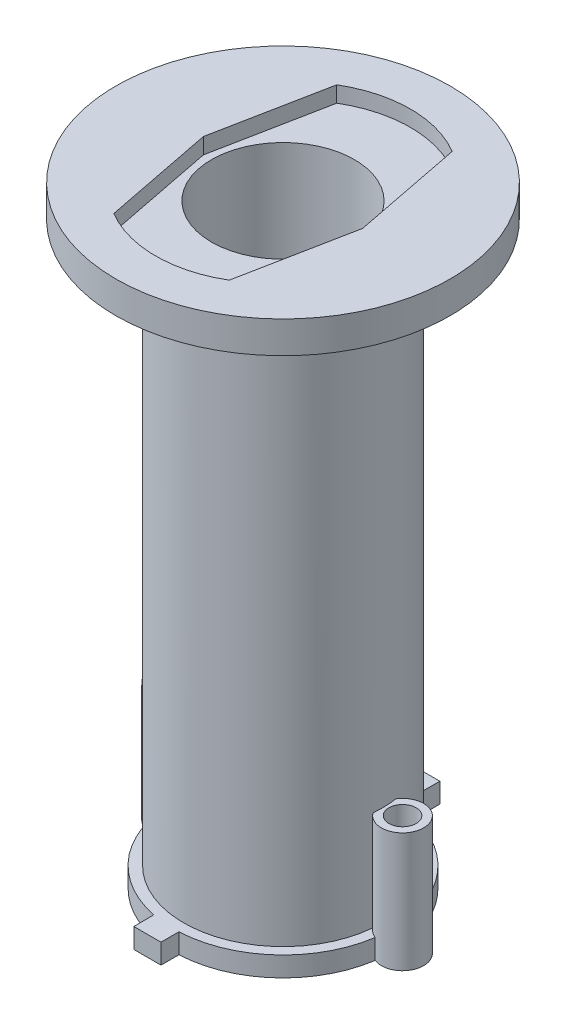
ISO-10303-21;
HEADER;
FILE_DESCRIPTION(('STEP AP214'),'2;1');
FILE_NAME('part.step','',(''),(''),'','','');
FILE_SCHEMA(('AUTOMOTIVE_DESIGN { 1 0 10303 214 1 1 1 1 }'));
ENDSEC;
DATA;
#1=APPLICATION_CONTEXT('core data for automotive mechanical design processes');
#2=APPLICATION_PROTOCOL_DEFINITION('international standard','automotive_design',2000,#1);
#3=PRODUCT_CONTEXT('',#1,'mechanical');
#4=PRODUCT('Part','Part','',(#3));
#5=PRODUCT_RELATED_PRODUCT_CATEGORY('part','',(#4));
#6=PRODUCT_DEFINITION_FORMATION('','',#4);
#7=PRODUCT_DEFINITION_CONTEXT('part definition',#1,'design');
#8=PRODUCT_DEFINITION('design','',#6,#7);
#9=PRODUCT_DEFINITION_SHAPE('','',#8);
#10=(LENGTH_UNIT() NAMED_UNIT(*) SI_UNIT(.MILLI.,.METRE.));
#11=(NAMED_UNIT(*) PLANE_ANGLE_UNIT() SI_UNIT($,.RADIAN.));
#12=(NAMED_UNIT(*) SI_UNIT($,.STERADIAN.) SOLID_ANGLE_UNIT());
#13=UNCERTAINTY_MEASURE_WITH_UNIT(LENGTH_MEASURE(1.E-05),#10,'distance_accuracy_value','');
#14=(GEOMETRIC_REPRESENTATION_CONTEXT(3) GLOBAL_UNCERTAINTY_ASSIGNED_CONTEXT((#13)) GLOBAL_UNIT_ASSIGNED_CONTEXT((#10,
#11,#12)) REPRESENTATION_CONTEXT('',''));
#15=CARTESIAN_POINT('',(0.,0.,0.));
#16=DIRECTION('',(0.,0.,1.));
#17=DIRECTION('',(1.,0.,0.));
#18=AXIS2_PLACEMENT_3D('',#15,#16,#17);
#19=CARTESIAN_POINT('',(-0.0762000000000037,2.5,1.51384));
#20=DIRECTION('',(0.,1.,0.));
#21=DIRECTION('',(0.,0.,1.));
#22=AXIS2_PLACEMENT_3D('',#19,#20,#21);
#23=PLANE('',#22);
#24=CARTESIAN_POINT('',(-14.5034,2.5,1.0795));
#25=DIRECTION('',(0.,1.,0.));
#26=DIRECTION('',(0.,0.,1.));
#27=AXIS2_PLACEMENT_3D('',#24,#25,#26);
#28=CIRCLE('',#27,2.6543);
#29=CARTESIAN_POINT('',(-12.3886077372189,2.5,-0.524545565213582));
#30=VERTEX_POINT('',#29);
#31=CARTESIAN_POINT('',(-13.5330312519173,2.5,-1.39106531642952));
#32=VERTEX_POINT('',#31);
#33=EDGE_CURVE('E253',#30,#32,#28,.T.);
#34=ORIENTED_EDGE('',*,*,#33,.F.);
#35=CARTESIAN_POINT('',(-0.0762000000000037,2.5,1.51384));
#36=DIRECTION('',(0.,1.,0.));
#37=DIRECTION('',(0.,0.,1.));
#38=AXIS2_PLACEMENT_3D('',#35,#36,#37);
#39=CIRCLE('',#38,12.48);
#40=CARTESIAN_POINT('',(12.2644264634765,2.5,-0.346089700000451));
#41=VERTEX_POINT('',#40);
#42=EDGE_CURVE('E332',#41,#30,#39,.T.);
#43=ORIENTED_EDGE('',*,*,#42,.F.);
#44=CARTESIAN_POINT('',(14.5034,2.5,1.0795));
#45=DIRECTION('',(0.,1.,0.));
#46=DIRECTION('',(0.,0.,1.));
#47=AXIS2_PLACEMENT_3D('',#44,#45,#46);
#48=CIRCLE('',#47,2.65430000000001);
#49=CARTESIAN_POINT('',(13.3933444870035,2.5,-1.33153406198795));
#50=VERTEX_POINT('',#49);
#51=EDGE_CURVE('E254',#50,#41,#48,.T.);
#52=ORIENTED_EDGE('',*,*,#51,.F.);
#53=CARTESIAN_POINT('',(-0.0762000000000037,2.5,1.51384));
#54=DIRECTION('',(0.,1.,0.));
#55=DIRECTION('',(0.,0.,1.));
#56=AXIS2_PLACEMENT_3D('',#53,#54,#55);
#57=CIRCLE('',#56,13.7668);
#58=CARTESIAN_POINT('',(0.597960957999996,2.5,-12.2364432422721));
#59=VERTEX_POINT('',#58);
#60=EDGE_CURVE('E188',#50,#59,#57,.T.);
#61=ORIENTED_EDGE('',*,*,#60,.T.);
#62=DIRECTION('',(0.,0.,-1.));
#63=VECTOR('',#62,1.);
#64=CARTESIAN_POINT('',(0.597960957999996,2.5,-12.2364432422721));
#65=LINE('',#64,#63);
#66=CARTESIAN_POINT('',(0.597960957999998,2.5,-17.5133));
#67=VERTEX_POINT('',#66);
#68=EDGE_CURVE('E110',#59,#67,#65,.T.);
#69=ORIENTED_EDGE('',*,*,#68,.T.);
#70=DIRECTION('',(-1.,0.,0.));
#71=VECTOR('',#70,1.);
#72=CARTESIAN_POINT('',(0.597960957999998,2.5,-17.5133));
#73=LINE('',#72,#71);
#74=CARTESIAN_POINT('',(-2.819411684,2.5,-17.5133));
#75=VERTEX_POINT('',#74);
#76=EDGE_CURVE('E214',#67,#75,#73,.T.);
#77=ORIENTED_EDGE('',*,*,#76,.T.);
#78=DIRECTION('',(0.,0.,1.));
#79=VECTOR('',#78,1.);
#80=CARTESIAN_POINT('',(-2.819411684,2.5,-17.5133));
#81=LINE('',#80,#79);
#82=CARTESIAN_POINT('',(-2.819411684,2.5,-11.9768816966612));
#83=VERTEX_POINT('',#82);
#84=EDGE_CURVE('E234',#75,#83,#81,.T.);
#85=ORIENTED_EDGE('',*,*,#84,.T.);
#86=CARTESIAN_POINT('',(-0.0762000000000037,2.5,1.51384));
#87=DIRECTION('',(0.,1.,0.));
#88=DIRECTION('',(0.,0.,1.));
#89=AXIS2_PLACEMENT_3D('',#86,#87,#88);
#90=CIRCLE('',#89,13.7668);
#91=EDGE_CURVE('E230',#83,#32,#90,.T.);
#92=ORIENTED_EDGE('',*,*,#91,.T.);
#93=EDGE_LOOP('',(#34,#43,#52,#61,#69,#77,#85,#92));
#94=FACE_BOUND('',#93,.T.);
#95=ADVANCED_FACE('F33',(#94),#23,.T.);
#96=CARTESIAN_POINT('',(12.3532611180342,2.5,2.63584548807739));
#97=VERTEX_POINT('',#96);
#98=CARTESIAN_POINT('',(13.5388396547462,2.5,3.55233882013443));
#99=VERTEX_POINT('',#98);
#100=EDGE_CURVE('E57',#97,#99,#48,.T.);
#101=ORIENTED_EDGE('',*,*,#100,.F.);
#102=CARTESIAN_POINT('',(-12.4889319057638,2.5,2.80785956539843));
#103=VERTEX_POINT('',#102);
#104=EDGE_CURVE('E329',#103,#97,#39,.T.);
#105=ORIENTED_EDGE('',*,*,#104,.F.);
#106=CARTESIAN_POINT('',(-13.6834098116879,2.5,3.60396520694422));
#107=VERTEX_POINT('',#106);
#108=EDGE_CURVE('E248',#107,#103,#28,.T.);
#109=ORIENTED_EDGE('',*,*,#108,.F.);
#110=CARTESIAN_POINT('',(-0.0762000000000037,2.5,1.51384));
#111=DIRECTION('',(0.,1.,0.));
#112=DIRECTION('',(0.,0.,1.));
#113=AXIS2_PLACEMENT_3D('',#110,#111,#112);
#114=CIRCLE('',#113,13.7668);
#115=CARTESIAN_POINT('',(-2.81941168400001,2.5,15.0045616966612));
#116=VERTEX_POINT('',#115);
#117=EDGE_CURVE('E233',#107,#116,#114,.T.);
#118=ORIENTED_EDGE('',*,*,#117,.T.);
#119=DIRECTION('',(0.,0.,1.));
#120=VECTOR('',#119,1.);
#121=CARTESIAN_POINT('',(-2.81941168400001,2.5,15.0045616966612));
#122=LINE('',#121,#120);
#123=CARTESIAN_POINT('',(-2.819411684,2.5,17.5133));
#124=VERTEX_POINT('',#123);
#125=EDGE_CURVE('E140',#116,#124,#122,.T.);
#126=ORIENTED_EDGE('',*,*,#125,.T.);
#127=DIRECTION('',(1.,0.,0.));
#128=VECTOR('',#127,1.);
#129=CARTESIAN_POINT('',(-2.819411684,2.5,17.5133));
#130=LINE('',#129,#128);
#131=CARTESIAN_POINT('',(0.597960957999998,2.5,17.5133));
#132=VERTEX_POINT('',#131);
#133=EDGE_CURVE('E133',#124,#132,#130,.T.);
#134=ORIENTED_EDGE('',*,*,#133,.T.);
#135=DIRECTION('',(0.,0.,-1.));
#136=VECTOR('',#135,1.);
#137=CARTESIAN_POINT('',(0.597960957999998,2.5,17.5133));
#138=LINE('',#137,#136);
#139=CARTESIAN_POINT('',(0.597960957999998,2.5,15.2641232422721));
#140=VERTEX_POINT('',#139);
#141=EDGE_CURVE('E137',#132,#140,#138,.T.);
#142=ORIENTED_EDGE('',*,*,#141,.T.);
#143=CARTESIAN_POINT('',(-0.0762000000000037,2.5,1.51384));
#144=DIRECTION('',(0.,1.,0.));
#145=DIRECTION('',(0.,0.,1.));
#146=AXIS2_PLACEMENT_3D('',#143,#144,#145);
#147=CIRCLE('',#146,13.7668);
#148=EDGE_CURVE('E158',#140,#99,#147,.T.);
#149=ORIENTED_EDGE('',*,*,#148,.T.);
#150=EDGE_LOOP('',(#101,#105,#109,#118,#126,#134,#142,#149));
#151=FACE_BOUND('',#150,.T.);
#152=ADVANCED_FACE('F135',(#151),#23,.T.);
#153=CARTESIAN_POINT('',(-14.5034,2.5,1.0795));
#154=DIRECTION('',(0.,-1.,0.));
#155=DIRECTION('',(0.,0.,-1.));
#156=AXIS2_PLACEMENT_3D('',#153,#154,#155);
#157=CYLINDRICAL_SURFACE('',#156,2.6543);
#158=DIRECTION('',(0.,-1.,0.));
#159=VECTOR('',#158,1.);
#160=CARTESIAN_POINT('',(-12.4889319057638,19.1525,2.80785956539843));
#161=LINE('',#160,#159);
#162=CARTESIAN_POINT('',(-12.4889319057638,15.,2.80785956539843));
#163=VERTEX_POINT('',#162);
#164=EDGE_CURVE('E316',#163,#103,#161,.T.);
#165=ORIENTED_EDGE('',*,*,#164,.F.);
#166=CARTESIAN_POINT('',(-14.5034,15.,1.0795));
#167=DIRECTION('',(0.,-1.,0.));
#168=DIRECTION('',(0.,0.,-1.));
#169=AXIS2_PLACEMENT_3D('',#166,#167,#168);
#170=CIRCLE('',#169,2.6543);
#171=CARTESIAN_POINT('',(-12.3886077372189,15.,-0.524545565213582));
#172=VERTEX_POINT('',#171);
#173=EDGE_CURVE('E333',#163,#172,#170,.T.);
#174=ORIENTED_EDGE('',*,*,#173,.T.);
#175=DIRECTION('',(0.,-1.,0.));
#176=VECTOR('',#175,1.);
#177=CARTESIAN_POINT('',(-12.3886077372189,19.1525,-0.524545565213585));
#178=LINE('',#177,#176);
#179=EDGE_CURVE('E322',#30,#172,#178,.F.);
#180=ORIENTED_EDGE('',*,*,#179,.F.);
#181=ORIENTED_EDGE('',*,*,#33,.T.);
#182=DIRECTION('',(0.,-1.,0.));
#183=VECTOR('',#182,1.);
#184=CARTESIAN_POINT('',(-13.5330312519173,2.5,-1.39106531642952));
#185=LINE('',#184,#183);
#186=CARTESIAN_POINT('',(-13.5330312519173,0.,-1.39106531642952));
#187=VERTEX_POINT('',#186);
#188=EDGE_CURVE('E200',#32,#187,#185,.T.);
#189=ORIENTED_EDGE('',*,*,#188,.T.);
#190=CARTESIAN_POINT('',(-14.5034,0.,1.0795));
#191=DIRECTION('',(0.,1.,0.));
#192=DIRECTION('',(0.,0.,1.));
#193=AXIS2_PLACEMENT_3D('',#190,#191,#192);
#194=CIRCLE('',#193,2.6543);
#195=CARTESIAN_POINT('',(-13.6834098116879,0.,3.60396520694422));
#196=VERTEX_POINT('',#195);
#197=EDGE_CURVE('E176',#187,#196,#194,.T.);
#198=ORIENTED_EDGE('',*,*,#197,.T.);
#199=DIRECTION('',(0.,-1.,0.));
#200=VECTOR('',#199,1.);
#201=CARTESIAN_POINT('',(-13.6834098116879,2.5,3.60396520694422));
#202=LINE('',#201,#200);
#203=EDGE_CURVE('E197',#107,#196,#202,.T.);
#204=ORIENTED_EDGE('',*,*,#203,.F.);
#205=ORIENTED_EDGE('',*,*,#108,.T.);
#206=EDGE_LOOP('',(#165,#174,#180,#181,#189,#198,#204,#205));
#207=FACE_BOUND('',#206,.T.);
#208=ADVANCED_FACE('F367',(#207),#157,.T.);
#209=CARTESIAN_POINT('',(14.5034,2.5,1.0795));
#210=DIRECTION('',(0.,-1.,0.));
#211=DIRECTION('',(0.,0.,-1.));
#212=AXIS2_PLACEMENT_3D('',#209,#210,#211);
#213=CYLINDRICAL_SURFACE('',#212,2.6543);
#214=DIRECTION('',(0.,-1.,0.));
#215=VECTOR('',#214,1.);
#216=CARTESIAN_POINT('',(12.2644264634765,19.1525,-0.346089700000466));
#217=LINE('',#216,#215);
#218=CARTESIAN_POINT('',(12.2644264634765,15.,-0.346089700000459));
#219=VERTEX_POINT('',#218);
#220=EDGE_CURVE('E325',#219,#41,#217,.T.);
#221=ORIENTED_EDGE('',*,*,#220,.F.);
#222=CARTESIAN_POINT('',(14.5034,15.,1.0795));
#223=DIRECTION('',(0.,-1.,0.));
#224=DIRECTION('',(0.,0.,-1.));
#225=AXIS2_PLACEMENT_3D('',#222,#223,#224);
#226=CIRCLE('',#225,2.6543);
#227=CARTESIAN_POINT('',(12.3532611180342,15.,2.6358454880774));
#228=VERTEX_POINT('',#227);
#229=EDGE_CURVE('E338',#219,#228,#226,.T.);
#230=ORIENTED_EDGE('',*,*,#229,.T.);
#231=DIRECTION('',(0.,-1.,0.));
#232=VECTOR('',#231,1.);
#233=CARTESIAN_POINT('',(12.3532611180342,19.1525,2.63584548807741));
#234=LINE('',#233,#232);
#235=EDGE_CURVE('E319',#97,#228,#234,.F.);
#236=ORIENTED_EDGE('',*,*,#235,.F.);
#237=ORIENTED_EDGE('',*,*,#100,.T.);
#238=DIRECTION('',(0.,-1.,0.));
#239=VECTOR('',#238,1.);
#240=CARTESIAN_POINT('',(13.5388396547462,2.5,3.55233882013443));
#241=LINE('',#240,#239);
#242=CARTESIAN_POINT('',(13.5388396547462,0.,3.55233882013443));
#243=VERTEX_POINT('',#242);
#244=EDGE_CURVE('E190',#99,#243,#241,.T.);
#245=ORIENTED_EDGE('',*,*,#244,.T.);
#246=CARTESIAN_POINT('',(14.5034,0.,1.0795));
#247=DIRECTION('',(0.,1.,0.));
#248=DIRECTION('',(0.,0.,1.));
#249=AXIS2_PLACEMENT_3D('',#246,#247,#248);
#250=CIRCLE('',#249,2.6543);
#251=CARTESIAN_POINT('',(13.3933444870035,0.,-1.33153406198795));
#252=VERTEX_POINT('',#251);
#253=EDGE_CURVE('E102',#243,#252,#250,.T.);
#254=ORIENTED_EDGE('',*,*,#253,.T.);
#255=DIRECTION('',(0.,-1.,0.));
#256=VECTOR('',#255,1.);
#257=CARTESIAN_POINT('',(13.3933444870035,2.5,-1.33153406198795));
#258=LINE('',#257,#256);
#259=EDGE_CURVE('E160',#50,#252,#258,.T.);
#260=ORIENTED_EDGE('',*,*,#259,.F.);
#261=ORIENTED_EDGE('',*,*,#51,.T.);
#262=EDGE_LOOP('',(#221,#230,#236,#237,#245,#254,#260,#261));
#263=FACE_BOUND('',#262,.T.);
#264=ADVANCED_FACE('F380',(#263),#213,.T.);
#265=CARTESIAN_POINT('',(-0.0762000000000037,72.805,1.51384));
#266=DIRECTION('',(0.,1.,0.));
#267=DIRECTION('',(0.,0.,1.));
#268=AXIS2_PLACEMENT_3D('',#265,#266,#267);
#269=PLANE('',#268);
#270=CARTESIAN_POINT('',(-0.0762000000000037,72.805,1.51384));
#271=DIRECTION('',(0.,1.,0.));
#272=DIRECTION('',(0.,0.,1.));
#273=AXIS2_PLACEMENT_3D('',#270,#271,#272);
#274=CIRCLE('',#273,21.);
#275=CARTESIAN_POINT('',(-0.0762000000000037,72.805,22.51384));
#276=VERTEX_POINT('',#275);
#277=EDGE_CURVE('E257',#276,#276,#274,.T.);
#278=ORIENTED_EDGE('',*,*,#277,.F.);
#279=EDGE_LOOP('',(#278));
#280=FACE_BOUND('',#279,.T.);
#281=CARTESIAN_POINT('',(-0.0762000000000037,72.805,1.51384));
#282=DIRECTION('',(0.,1.,0.));
#283=DIRECTION('',(0.,0.,1.));
#284=AXIS2_PLACEMENT_3D('',#281,#282,#283);
#285=CIRCLE('',#284,12.48);
#286=CARTESIAN_POINT('',(-0.0762000000000037,72.805,13.99384));
#287=VERTEX_POINT('',#286);
#288=EDGE_CURVE('E328',#287,#287,#285,.T.);
#289=ORIENTED_EDGE('',*,*,#288,.T.);
#290=EDGE_LOOP('',(#289));
#291=FACE_BOUND('',#290,.T.);
#292=ADVANCED_FACE('F470',(#280,#291),#269,.F.);
#293=CARTESIAN_POINT('',(-0.0762000000000037,2.5,1.51384));
#294=DIRECTION('',(0.,-1.,0.));
#295=DIRECTION('',(0.,0.,-1.));
#296=AXIS2_PLACEMENT_3D('',#293,#294,#295);
#297=CYLINDRICAL_SURFACE('',#296,13.7668);
#298=CARTESIAN_POINT('',(-0.0762000000000037,0.,1.51384));
#299=DIRECTION('',(0.,1.,0.));
#300=DIRECTION('',(0.,0.,1.));
#301=AXIS2_PLACEMENT_3D('',#298,#299,#300);
#302=CIRCLE('',#301,13.7668);
#303=CARTESIAN_POINT('',(0.597960957999996,0.,-12.2364432422721));
#304=VERTEX_POINT('',#303);
#305=EDGE_CURVE('E164',#252,#304,#302,.T.);
#306=ORIENTED_EDGE('',*,*,#305,.T.);
#307=DIRECTION('',(0.,-1.,0.));
#308=VECTOR('',#307,1.);
#309=CARTESIAN_POINT('',(0.597960957999996,2.5,-12.2364432422721));
#310=LINE('',#309,#308);
#311=EDGE_CURVE('E11',#59,#304,#310,.T.);
#312=ORIENTED_EDGE('',*,*,#311,.F.);
#313=ORIENTED_EDGE('',*,*,#60,.F.);
#314=ORIENTED_EDGE('',*,*,#259,.T.);
#315=EDGE_LOOP('',(#306,#312,#313,#314));
#316=FACE_BOUND('',#315,.T.);
#317=ADVANCED_FACE('F35',(#316),#297,.T.);
#318=CARTESIAN_POINT('',(0.597960957999996,2.5,-12.2364432422721));
#319=DIRECTION('',(-1.,0.,0.));
#320=DIRECTION('',(0.,0.,1.));
#321=AXIS2_PLACEMENT_3D('',#318,#319,#320);
#322=PLANE('',#321);
#323=DIRECTION('',(0.,0.,-1.));
#324=VECTOR('',#323,1.);
#325=CARTESIAN_POINT('',(0.597960957999996,0.,-12.2364432422721));
#326=LINE('',#325,#324);
#327=CARTESIAN_POINT('',(0.597960957999998,0.,-17.5133));
#328=VERTEX_POINT('',#327);
#329=EDGE_CURVE('E167',#304,#328,#326,.T.);
#330=ORIENTED_EDGE('',*,*,#329,.T.);
#331=DIRECTION('',(0.,-1.,0.));
#332=VECTOR('',#331,1.);
#333=CARTESIAN_POINT('',(0.597960957999998,2.5,-17.5133));
#334=LINE('',#333,#332);
#335=EDGE_CURVE('E41',#67,#328,#334,.T.);
#336=ORIENTED_EDGE('',*,*,#335,.F.);
#337=ORIENTED_EDGE('',*,*,#68,.F.);
#338=ORIENTED_EDGE('',*,*,#311,.T.);
#339=EDGE_LOOP('',(#330,#336,#337,#338));
#340=FACE_BOUND('',#339,.T.);
#341=ADVANCED_FACE('F492',(#340),#322,.F.);
#342=CARTESIAN_POINT('',(0.597960957999998,2.5,-17.5133));
#343=DIRECTION('',(0.,0.,1.));
#344=DIRECTION('',(1.,0.,0.));
#345=AXIS2_PLACEMENT_3D('',#342,#343,#344);
#346=PLANE('',#345);
#347=DIRECTION('',(-1.,0.,0.));
#348=VECTOR('',#347,1.);
#349=CARTESIAN_POINT('',(0.597960957999998,0.,-17.5133));
#350=LINE('',#349,#348);
#351=CARTESIAN_POINT('',(-2.819411684,0.,-17.5133));
#352=VERTEX_POINT('',#351);
#353=EDGE_CURVE('E170',#328,#352,#350,.T.);
#354=ORIENTED_EDGE('',*,*,#353,.T.);
#355=DIRECTION('',(0.,-1.,0.));
#356=VECTOR('',#355,1.);
#357=CARTESIAN_POINT('',(-2.819411684,2.5,-17.5133));
#358=LINE('',#357,#356);
#359=EDGE_CURVE('E206',#75,#352,#358,.T.);
#360=ORIENTED_EDGE('',*,*,#359,.F.);
#361=ORIENTED_EDGE('',*,*,#76,.F.);
#362=ORIENTED_EDGE('',*,*,#335,.T.);
#363=EDGE_LOOP('',(#354,#360,#361,#362));
#364=FACE_BOUND('',#363,.T.);
#365=ADVANCED_FACE('F212',(#364),#346,.F.);
#366=CARTESIAN_POINT('',(-2.819411684,2.5,-17.5133));
#367=DIRECTION('',(1.,0.,0.));
#368=DIRECTION('',(0.,0.,-1.));
#369=AXIS2_PLACEMENT_3D('',#366,#367,#368);
#370=PLANE('',#369);
#371=DIRECTION('',(0.,0.,1.));
#372=VECTOR('',#371,1.);
#373=CARTESIAN_POINT('',(-2.819411684,0.,-17.5133));
#374=LINE('',#373,#372);
#375=CARTESIAN_POINT('',(-2.819411684,0.,-11.9768816966612));
#376=VERTEX_POINT('',#375);
#377=EDGE_CURVE('E172',#352,#376,#374,.T.);
#378=ORIENTED_EDGE('',*,*,#377,.T.);
#379=DIRECTION('',(0.,-1.,0.));
#380=VECTOR('',#379,1.);
#381=CARTESIAN_POINT('',(-2.819411684,2.5,-11.9768816966612));
#382=LINE('',#381,#380);
#383=EDGE_CURVE('E203',#83,#376,#382,.T.);
#384=ORIENTED_EDGE('',*,*,#383,.F.);
#385=ORIENTED_EDGE('',*,*,#84,.F.);
#386=ORIENTED_EDGE('',*,*,#359,.T.);
#387=EDGE_LOOP('',(#378,#384,#385,#386));
#388=FACE_BOUND('',#387,.T.);
#389=ADVANCED_FACE('F223',(#388),#370,.F.);
#390=CARTESIAN_POINT('',(-0.0762000000000037,2.5,1.51384));
#391=DIRECTION('',(0.,-1.,0.));
#392=DIRECTION('',(0.,0.,-1.));
#393=AXIS2_PLACEMENT_3D('',#390,#391,#392);
#394=CYLINDRICAL_SURFACE('',#393,13.7668);
#395=CARTESIAN_POINT('',(-0.0762000000000037,0.,1.51384));
#396=DIRECTION('',(0.,1.,0.));
#397=DIRECTION('',(0.,0.,1.));
#398=AXIS2_PLACEMENT_3D('',#395,#396,#397);
#399=CIRCLE('',#398,13.7668);
#400=EDGE_CURVE('E174',#376,#187,#399,.T.);
#401=ORIENTED_EDGE('',*,*,#400,.T.);
#402=ORIENTED_EDGE('',*,*,#188,.F.);
#403=ORIENTED_EDGE('',*,*,#91,.F.);
#404=ORIENTED_EDGE('',*,*,#383,.T.);
#405=EDGE_LOOP('',(#401,#402,#403,#404));
#406=FACE_BOUND('',#405,.T.);
#407=ADVANCED_FACE('F227',(#406),#394,.T.);
#408=CARTESIAN_POINT('',(-0.0762000000000037,2.5,1.51384));
#409=DIRECTION('',(0.,-1.,0.));
#410=DIRECTION('',(0.,0.,-1.));
#411=AXIS2_PLACEMENT_3D('',#408,#409,#410);
#412=CYLINDRICAL_SURFACE('',#411,13.7668);
#413=CARTESIAN_POINT('',(-0.0762000000000037,0.,1.51384));
#414=DIRECTION('',(0.,1.,0.));
#415=DIRECTION('',(0.,0.,1.));
#416=AXIS2_PLACEMENT_3D('',#413,#414,#415);
#417=CIRCLE('',#416,13.7668);
#418=CARTESIAN_POINT('',(-2.81941168400001,0.,15.0045616966612));
#419=VERTEX_POINT('',#418);
#420=EDGE_CURVE('E178',#196,#419,#417,.T.);
#421=ORIENTED_EDGE('',*,*,#420,.T.);
#422=DIRECTION('',(0.,-1.,0.));
#423=VECTOR('',#422,1.);
#424=CARTESIAN_POINT('',(-2.81941168400001,2.5,15.0045616966612));
#425=LINE('',#424,#423);
#426=EDGE_CURVE('E194',#116,#419,#425,.T.);
#427=ORIENTED_EDGE('',*,*,#426,.F.);
#428=ORIENTED_EDGE('',*,*,#117,.F.);
#429=ORIENTED_EDGE('',*,*,#203,.T.);
#430=EDGE_LOOP('',(#421,#427,#428,#429));
#431=FACE_BOUND('',#430,.T.);
#432=ADVANCED_FACE('F480',(#431),#412,.T.);
#433=CARTESIAN_POINT('',(-2.81941168400001,2.5,15.0045616966612));
#434=DIRECTION('',(1.,0.,0.));
#435=DIRECTION('',(0.,0.,-1.));
#436=AXIS2_PLACEMENT_3D('',#433,#434,#435);
#437=PLANE('',#436);
#438=DIRECTION('',(0.,0.,1.));
#439=VECTOR('',#438,1.);
#440=CARTESIAN_POINT('',(-2.81941168400001,0.,15.0045616966612));
#441=LINE('',#440,#439);
#442=CARTESIAN_POINT('',(-2.819411684,0.,17.5133));
#443=VERTEX_POINT('',#442);
#444=EDGE_CURVE('E180',#419,#443,#441,.T.);
#445=ORIENTED_EDGE('',*,*,#444,.T.);
#446=DIRECTION('',(0.,-1.,0.));
#447=VECTOR('',#446,1.);
#448=CARTESIAN_POINT('',(-2.819411684,2.5,17.5133));
#449=LINE('',#448,#447);
#450=EDGE_CURVE('E152',#124,#443,#449,.T.);
#451=ORIENTED_EDGE('',*,*,#450,.F.);
#452=ORIENTED_EDGE('',*,*,#125,.F.);
#453=ORIENTED_EDGE('',*,*,#426,.T.);
#454=EDGE_LOOP('',(#445,#451,#452,#453));
#455=FACE_BOUND('',#454,.T.);
#456=ADVANCED_FACE('F477',(#455),#437,.F.);
#457=CARTESIAN_POINT('',(-2.819411684,2.5,17.5133));
#458=DIRECTION('',(0.,0.,-1.));
#459=DIRECTION('',(-1.,0.,0.));
#460=AXIS2_PLACEMENT_3D('',#457,#458,#459);
#461=PLANE('',#460);
#462=DIRECTION('',(1.,0.,0.));
#463=VECTOR('',#462,1.);
#464=CARTESIAN_POINT('',(-2.819411684,0.,17.5133));
#465=LINE('',#464,#463);
#466=CARTESIAN_POINT('',(0.597960957999998,0.,17.5133));
#467=VERTEX_POINT('',#466);
#468=EDGE_CURVE('E149',#443,#467,#465,.T.);
#469=ORIENTED_EDGE('',*,*,#468,.T.);
#470=DIRECTION('',(0.,-1.,0.));
#471=VECTOR('',#470,1.);
#472=CARTESIAN_POINT('',(0.597960957999998,2.5,17.5133));
#473=LINE('',#472,#471);
#474=EDGE_CURVE('E146',#132,#467,#473,.T.);
#475=ORIENTED_EDGE('',*,*,#474,.F.);
#476=ORIENTED_EDGE('',*,*,#133,.F.);
#477=ORIENTED_EDGE('',*,*,#450,.T.);
#478=EDGE_LOOP('',(#469,#475,#476,#477));
#479=FACE_BOUND('',#478,.T.);
#480=ADVANCED_FACE('F147',(#479),#461,.F.);
#481=CARTESIAN_POINT('',(0.597960957999998,2.5,17.5133));
#482=DIRECTION('',(-1.,0.,0.));
#483=DIRECTION('',(0.,0.,1.));
#484=AXIS2_PLACEMENT_3D('',#481,#482,#483);
#485=PLANE('',#484);
#486=DIRECTION('',(0.,0.,-1.));
#487=VECTOR('',#486,1.);
#488=CARTESIAN_POINT('',(0.597960957999998,0.,17.5133));
#489=LINE('',#488,#487);
#490=CARTESIAN_POINT('',(0.597960957999998,0.,15.2641232422721));
#491=VERTEX_POINT('',#490);
#492=EDGE_CURVE('E183',#467,#491,#489,.T.);
#493=ORIENTED_EDGE('',*,*,#492,.T.);
#494=DIRECTION('',(0.,-1.,0.));
#495=VECTOR('',#494,1.);
#496=CARTESIAN_POINT('',(0.597960957999998,2.5,15.2641232422721));
#497=LINE('',#496,#495);
#498=EDGE_CURVE('E153',#140,#491,#497,.T.);
#499=ORIENTED_EDGE('',*,*,#498,.F.);
#500=ORIENTED_EDGE('',*,*,#141,.F.);
#501=ORIENTED_EDGE('',*,*,#474,.T.);
#502=EDGE_LOOP('',(#493,#499,#500,#501));
#503=FACE_BOUND('',#502,.T.);
#504=ADVANCED_FACE('F155',(#503),#485,.F.);
#505=CARTESIAN_POINT('',(-0.0762000000000037,2.5,1.51384));
#506=DIRECTION('',(0.,-1.,0.));
#507=DIRECTION('',(0.,0.,-1.));
#508=AXIS2_PLACEMENT_3D('',#505,#506,#507);
#509=CYLINDRICAL_SURFACE('',#508,13.7668);
#510=CARTESIAN_POINT('',(-0.0762000000000037,0.,1.51384));
#511=DIRECTION('',(0.,1.,0.));
#512=DIRECTION('',(0.,0.,1.));
#513=AXIS2_PLACEMENT_3D('',#510,#511,#512);
#514=CIRCLE('',#513,13.7668);
#515=EDGE_CURVE('E185',#491,#243,#514,.T.);
#516=ORIENTED_EDGE('',*,*,#515,.T.);
#517=ORIENTED_EDGE('',*,*,#244,.F.);
#518=ORIENTED_EDGE('',*,*,#148,.F.);
#519=ORIENTED_EDGE('',*,*,#498,.T.);
#520=EDGE_LOOP('',(#516,#517,#518,#519));
#521=FACE_BOUND('',#520,.T.);
#522=ADVANCED_FACE('F389',(#521),#509,.T.);
#523=CARTESIAN_POINT('',(-0.0762000000000037,0.,1.51384));
#524=DIRECTION('',(0.,1.,0.));
#525=DIRECTION('',(0.,0.,1.));
#526=AXIS2_PLACEMENT_3D('',#523,#524,#525);
#527=PLANE('',#526);
#528=CARTESIAN_POINT('',(14.5034,0.,1.0795));
#529=DIRECTION('',(0.,1.,0.));
#530=DIRECTION('',(0.,0.,1.));
#531=AXIS2_PLACEMENT_3D('',#528,#529,#530);
#532=CIRCLE('',#531,1.715);
#533=CARTESIAN_POINT('',(14.5034,0.,2.7945));
#534=VERTEX_POINT('',#533);
#535=EDGE_CURVE('E244',#534,#534,#532,.F.);
#536=ORIENTED_EDGE('',*,*,#535,.F.);
#537=EDGE_LOOP('',(#536));
#538=FACE_BOUND('',#537,.T.);
#539=CARTESIAN_POINT('',(-0.0762000000000037,0.,1.51384));
#540=DIRECTION('',(0.,1.,0.));
#541=DIRECTION('',(0.,0.,1.));
#542=AXIS2_PLACEMENT_3D('',#539,#540,#541);
#543=CIRCLE('',#542,8.98);
#544=CARTESIAN_POINT('',(-0.0762000000000037,0.,10.49384));
#545=VERTEX_POINT('',#544);
#546=EDGE_CURVE('E245',#545,#545,#543,.F.);
#547=ORIENTED_EDGE('',*,*,#546,.F.);
#548=EDGE_LOOP('',(#547));
#549=FACE_BOUND('',#548,.T.);
#550=CARTESIAN_POINT('',(-14.5034,0.,1.0795));
#551=DIRECTION('',(0.,1.,0.));
#552=DIRECTION('',(0.,0.,1.));
#553=AXIS2_PLACEMENT_3D('',#550,#551,#552);
#554=CIRCLE('',#553,1.715);
#555=CARTESIAN_POINT('',(-14.5034,0.,2.7945));
#556=VERTEX_POINT('',#555);
#557=EDGE_CURVE('E168',#556,#556,#554,.F.);
#558=ORIENTED_EDGE('',*,*,#557,.F.);
#559=EDGE_LOOP('',(#558));
#560=FACE_BOUND('',#559,.T.);
#561=ORIENTED_EDGE('',*,*,#305,.F.);
#562=ORIENTED_EDGE('',*,*,#253,.F.);
#563=ORIENTED_EDGE('',*,*,#515,.F.);
#564=ORIENTED_EDGE('',*,*,#492,.F.);
#565=ORIENTED_EDGE('',*,*,#468,.F.);
#566=ORIENTED_EDGE('',*,*,#444,.F.);
#567=ORIENTED_EDGE('',*,*,#420,.F.);
#568=ORIENTED_EDGE('',*,*,#197,.F.);
#569=ORIENTED_EDGE('',*,*,#400,.F.);
#570=ORIENTED_EDGE('',*,*,#377,.F.);
#571=ORIENTED_EDGE('',*,*,#353,.F.);
#572=ORIENTED_EDGE('',*,*,#329,.F.);
#573=EDGE_LOOP('',(#561,#562,#563,#564,#565,#566,#567,#568,#569,#570,#571,#572));
#574=FACE_BOUND('',#573,.T.);
#575=ADVANCED_FACE('F218',(#538,#549,#560,#574),#527,.F.);
#576=CARTESIAN_POINT('',(-14.5034,-0.00100000000000013,1.0795));
#577=DIRECTION('',(0.,1.,0.));
#578=DIRECTION('',(0.,0.,1.));
#579=AXIS2_PLACEMENT_3D('',#576,#577,#578);
#580=CYLINDRICAL_SURFACE('',#579,1.715);
#581=ORIENTED_EDGE('',*,*,#557,.T.);
#582=EDGE_LOOP('',(#581));
#583=FACE_BOUND('',#582,.T.);
#584=CARTESIAN_POINT('',(-14.5034,15.,1.0795));
#585=DIRECTION('',(0.,-1.,0.));
#586=DIRECTION('',(0.,0.,-1.));
#587=AXIS2_PLACEMENT_3D('',#584,#585,#586);
#588=CIRCLE('',#587,1.715);
#589=CARTESIAN_POINT('',(-14.5034,15.,-0.635500000000002));
#590=VERTEX_POINT('',#589);
#591=EDGE_CURVE('E341',#590,#590,#588,.F.);
#592=ORIENTED_EDGE('',*,*,#591,.T.);
#593=EDGE_LOOP('',(#592));
#594=FACE_BOUND('',#593,.T.);
#595=ADVANCED_FACE('F463',(#583,#594),#580,.F.);
#596=CARTESIAN_POINT('',(-0.0762000000000037,-0.00100000000000013,1.51384));
#597=DIRECTION('',(0.,1.,0.));
#598=DIRECTION('',(0.,0.,1.));
#599=AXIS2_PLACEMENT_3D('',#596,#597,#598);
#600=CYLINDRICAL_SURFACE('',#599,8.98);
#601=ORIENTED_EDGE('',*,*,#546,.T.);
#602=EDGE_LOOP('',(#601));
#603=FACE_BOUND('',#602,.T.);
#604=CARTESIAN_POINT('',(-0.0762000000000037,74.805,1.51384));
#605=DIRECTION('',(0.,1.,0.));
#606=DIRECTION('',(0.,0.,1.));
#607=AXIS2_PLACEMENT_3D('',#604,#605,#606);
#608=CIRCLE('',#607,8.98);
#609=CARTESIAN_POINT('',(-0.0762000000000037,74.805,10.49384));
#610=VERTEX_POINT('',#609);
#611=EDGE_CURVE('E297',#610,#610,#608,.T.);
#612=ORIENTED_EDGE('',*,*,#611,.T.);
#613=EDGE_LOOP('',(#612));
#614=FACE_BOUND('',#613,.T.);
#615=ADVANCED_FACE('F515',(#603,#614),#600,.F.);
#616=CARTESIAN_POINT('',(14.5034,-0.00100000000000013,1.0795));
#617=DIRECTION('',(0.,1.,0.));
#618=DIRECTION('',(0.,0.,1.));
#619=AXIS2_PLACEMENT_3D('',#616,#617,#618);
#620=CYLINDRICAL_SURFACE('',#619,1.715);
#621=ORIENTED_EDGE('',*,*,#535,.T.);
#622=EDGE_LOOP('',(#621));
#623=FACE_BOUND('',#622,.T.);
#624=CARTESIAN_POINT('',(14.5034,15.,1.0795));
#625=DIRECTION('',(0.,-1.,0.));
#626=DIRECTION('',(0.,0.,-1.));
#627=AXIS2_PLACEMENT_3D('',#624,#625,#626);
#628=CIRCLE('',#627,1.715);
#629=CARTESIAN_POINT('',(14.5034,15.,-0.635500000000004));
#630=VERTEX_POINT('',#629);
#631=EDGE_CURVE('E344',#630,#630,#628,.F.);
#632=ORIENTED_EDGE('',*,*,#631,.T.);
#633=EDGE_LOOP('',(#632));
#634=FACE_BOUND('',#633,.T.);
#635=ADVANCED_FACE('F513',(#623,#634),#620,.F.);
#636=CARTESIAN_POINT('',(-0.0762000000000037,76.805,1.51384));
#637=DIRECTION('',(0.,1.,0.));
#638=DIRECTION('',(0.,0.,1.));
#639=AXIS2_PLACEMENT_3D('',#636,#637,#638);
#640=PLANE('',#639);
#641=CARTESIAN_POINT('',(-0.0762000000000017,76.805,-0.345535000000039));
#642=DIRECTION('',(0.,1.,0.));
#643=DIRECTION('',(0.,0.,-1.));
#644=AXIS2_PLACEMENT_3D('',#641,#642,#643);
#645=CIRCLE('',#644,14.140625);
#646=CARTESIAN_POINT('',(7.1738,76.805,-12.48616));
#647=VERTEX_POINT('',#646);
#648=CARTESIAN_POINT('',(-7.32620000000001,76.805,-12.48616));
#649=VERTEX_POINT('',#648);
#650=EDGE_CURVE('E48',#647,#649,#645,.T.);
#651=ORIENTED_EDGE('',*,*,#650,.F.);
#652=DIRECTION('',(-0.192745304030928,0.,-0.981248820521087));
#653=VECTOR('',#652,1.);
#654=CARTESIAN_POINT('',(9.9238,76.805,1.51384));
#655=LINE('',#654,#653);
#656=CARTESIAN_POINT('',(9.9238,76.805,1.51384));
#657=VERTEX_POINT('',#656);
#658=EDGE_CURVE('E280',#657,#647,#655,.T.);
#659=ORIENTED_EDGE('',*,*,#658,.F.);
#660=DIRECTION('',(0.192745304030928,0.,-0.981248820521087));
#661=VECTOR('',#660,1.);
#662=CARTESIAN_POINT('',(7.1738,76.805,15.51384));
#663=LINE('',#662,#661);
#664=CARTESIAN_POINT('',(7.17379999999999,76.805,15.51384));
#665=VERTEX_POINT('',#664);
#666=EDGE_CURVE('E284',#665,#657,#663,.T.);
#667=ORIENTED_EDGE('',*,*,#666,.F.);
#668=CARTESIAN_POINT('',(-0.0762000000000089,76.805,3.37321499999991));
#669=DIRECTION('',(0.,1.,0.));
#670=DIRECTION('',(0.,0.,1.));
#671=AXIS2_PLACEMENT_3D('',#668,#669,#670);
#672=CIRCLE('',#671,14.1406250000001);
#673=CARTESIAN_POINT('',(-7.32620000000001,76.805,15.51384));
#674=VERTEX_POINT('',#673);
#675=EDGE_CURVE('E287',#674,#665,#672,.T.);
#676=ORIENTED_EDGE('',*,*,#675,.F.);
#677=DIRECTION('',(0.192745304030928,0.,0.981248820521087));
#678=VECTOR('',#677,1.);
#679=CARTESIAN_POINT('',(-10.0762,76.805,1.51384));
#680=LINE('',#679,#678);
#681=CARTESIAN_POINT('',(-10.0762,76.805,1.51384));
#682=VERTEX_POINT('',#681);
#683=EDGE_CURVE('E290',#682,#674,#680,.T.);
#684=ORIENTED_EDGE('',*,*,#683,.F.);
#685=DIRECTION('',(-0.192745304030928,0.,0.981248820521087));
#686=VECTOR('',#685,1.);
#687=CARTESIAN_POINT('',(-7.32620000000001,76.805,-12.48616));
#688=LINE('',#687,#686);
#689=EDGE_CURVE('E293',#649,#682,#688,.T.);
#690=ORIENTED_EDGE('',*,*,#689,.F.);
#691=EDGE_LOOP('',(#651,#659,#667,#676,#684,#690));
#692=FACE_BOUND('',#691,.T.);
#693=CARTESIAN_POINT('',(-0.0762000000000037,76.805,1.51384));
#694=DIRECTION('',(0.,1.,0.));
#695=DIRECTION('',(0.,0.,1.));
#696=AXIS2_PLACEMENT_3D('',#693,#694,#695);
#697=CIRCLE('',#696,21.);
#698=CARTESIAN_POINT('',(-0.0762000000000037,76.805,22.51384));
#699=VERTEX_POINT('',#698);
#700=EDGE_CURVE('E260',#699,#699,#697,.T.);
#701=ORIENTED_EDGE('',*,*,#700,.T.);
#702=EDGE_LOOP('',(#701));
#703=FACE_BOUND('',#702,.T.);
#704=ADVANCED_FACE('F430',(#692,#703),#640,.T.);
#705=CARTESIAN_POINT('',(-0.0762000000000037,76.805,1.51384));
#706=DIRECTION('',(0.,-1.,0.));
#707=DIRECTION('',(0.,0.,-1.));
#708=AXIS2_PLACEMENT_3D('',#705,#706,#707);
#709=CYLINDRICAL_SURFACE('',#708,21.);
#710=ORIENTED_EDGE('',*,*,#700,.F.);
#711=EDGE_LOOP('',(#710));
#712=FACE_BOUND('',#711,.T.);
#713=ORIENTED_EDGE('',*,*,#277,.T.);
#714=EDGE_LOOP('',(#713));
#715=FACE_BOUND('',#714,.T.);
#716=ADVANCED_FACE('F509',(#712,#715),#709,.T.);
#717=CARTESIAN_POINT('',(-0.0762000000000017,74.805,-0.345535000000039));
#718=DIRECTION('',(0.,1.,0.));
#719=DIRECTION('',(0.,0.,1.));
#720=AXIS2_PLACEMENT_3D('',#717,#718,#719);
#721=CYLINDRICAL_SURFACE('',#720,14.140625);
#722=ORIENTED_EDGE('',*,*,#650,.T.);
#723=DIRECTION('',(0.,1.,0.));
#724=VECTOR('',#723,1.);
#725=CARTESIAN_POINT('',(-7.32620000000001,74.805,-12.48616));
#726=LINE('',#725,#724);
#727=CARTESIAN_POINT('',(-7.32620000000001,74.805,-12.48616));
#728=VERTEX_POINT('',#727);
#729=EDGE_CURVE('E264',#728,#649,#726,.T.);
#730=ORIENTED_EDGE('',*,*,#729,.F.);
#731=CARTESIAN_POINT('',(-0.0762000000000017,74.805,-0.345535000000039));
#732=DIRECTION('',(0.,1.,0.));
#733=DIRECTION('',(0.,0.,-1.));
#734=AXIS2_PLACEMENT_3D('',#731,#732,#733);
#735=CIRCLE('',#734,14.140625);
#736=CARTESIAN_POINT('',(7.1738,74.805,-12.48616));
#737=VERTEX_POINT('',#736);
#738=EDGE_CURVE('E283',#737,#728,#735,.T.);
#739=ORIENTED_EDGE('',*,*,#738,.F.);
#740=DIRECTION('',(0.,1.,0.));
#741=VECTOR('',#740,1.);
#742=CARTESIAN_POINT('',(7.1738,74.805,-12.48616));
#743=LINE('',#742,#741);
#744=EDGE_CURVE('E261',#737,#647,#743,.T.);
#745=ORIENTED_EDGE('',*,*,#744,.T.);
#746=EDGE_LOOP('',(#722,#730,#739,#745));
#747=FACE_BOUND('',#746,.T.);
#748=ADVANCED_FACE('F422',(#747),#721,.F.);
#749=CARTESIAN_POINT('',(9.9238,74.805,1.51384));
#750=DIRECTION('',(0.981248820521087,0.,-0.192745304030928));
#751=DIRECTION('',(-0.192745304030928,0.,-0.981248820521087));
#752=AXIS2_PLACEMENT_3D('',#749,#750,#751);
#753=PLANE('',#752);
#754=ORIENTED_EDGE('',*,*,#658,.T.);
#755=ORIENTED_EDGE('',*,*,#744,.F.);
#756=DIRECTION('',(-0.192745304030928,0.,-0.981248820521087));
#757=VECTOR('',#756,1.);
#758=CARTESIAN_POINT('',(9.9238,74.805,1.51384));
#759=LINE('',#758,#757);
#760=CARTESIAN_POINT('',(9.9238,74.805,1.51384));
#761=VERTEX_POINT('',#760);
#762=EDGE_CURVE('E267',#761,#737,#759,.T.);
#763=ORIENTED_EDGE('',*,*,#762,.F.);
#764=DIRECTION('',(0.,1.,0.));
#765=VECTOR('',#764,1.);
#766=CARTESIAN_POINT('',(9.9238,74.805,1.51384));
#767=LINE('',#766,#765);
#768=EDGE_CURVE('E276',#761,#657,#767,.T.);
#769=ORIENTED_EDGE('',*,*,#768,.T.);
#770=EDGE_LOOP('',(#754,#755,#763,#769));
#771=FACE_BOUND('',#770,.T.);
#772=ADVANCED_FACE('F426',(#771),#753,.F.);
#773=CARTESIAN_POINT('',(7.1738,74.805,15.51384));
#774=DIRECTION('',(0.981248820521087,0.,0.192745304030928));
#775=DIRECTION('',(0.192745304030928,0.,-0.981248820521087));
#776=AXIS2_PLACEMENT_3D('',#773,#774,#775);
#777=PLANE('',#776);
#778=ORIENTED_EDGE('',*,*,#666,.T.);
#779=ORIENTED_EDGE('',*,*,#768,.F.);
#780=DIRECTION('',(0.192745304030928,0.,-0.981248820521087));
#781=VECTOR('',#780,1.);
#782=CARTESIAN_POINT('',(7.1738,74.805,15.51384));
#783=LINE('',#782,#781);
#784=CARTESIAN_POINT('',(7.17379999999999,74.805,15.51384));
#785=VERTEX_POINT('',#784);
#786=EDGE_CURVE('E300',#785,#761,#783,.T.);
#787=ORIENTED_EDGE('',*,*,#786,.F.);
#788=DIRECTION('',(0.,1.,0.));
#789=VECTOR('',#788,1.);
#790=CARTESIAN_POINT('',(7.17379999999999,74.805,15.51384));
#791=LINE('',#790,#789);
#792=EDGE_CURVE('E273',#785,#665,#791,.T.);
#793=ORIENTED_EDGE('',*,*,#792,.T.);
#794=EDGE_LOOP('',(#778,#779,#787,#793));
#795=FACE_BOUND('',#794,.T.);
#796=ADVANCED_FACE('F443',(#795),#777,.F.);
#797=CARTESIAN_POINT('',(-0.0762000000000089,74.805,3.37321499999991));
#798=DIRECTION('',(0.,1.,0.));
#799=DIRECTION('',(0.,0.,1.));
#800=AXIS2_PLACEMENT_3D('',#797,#798,#799);
#801=CYLINDRICAL_SURFACE('',#800,14.1406250000001);
#802=ORIENTED_EDGE('',*,*,#675,.T.);
#803=ORIENTED_EDGE('',*,*,#792,.F.);
#804=CARTESIAN_POINT('',(-0.0762000000000089,74.805,3.37321499999991));
#805=DIRECTION('',(0.,1.,0.));
#806=DIRECTION('',(0.,0.,1.));
#807=AXIS2_PLACEMENT_3D('',#804,#805,#806);
#808=CIRCLE('',#807,14.1406250000001);
#809=CARTESIAN_POINT('',(-7.32620000000001,74.805,15.51384));
#810=VERTEX_POINT('',#809);
#811=EDGE_CURVE('E303',#810,#785,#808,.T.);
#812=ORIENTED_EDGE('',*,*,#811,.F.);
#813=DIRECTION('',(0.,1.,0.));
#814=VECTOR('',#813,1.);
#815=CARTESIAN_POINT('',(-7.32620000000001,74.805,15.51384));
#816=LINE('',#815,#814);
#817=EDGE_CURVE('E270',#810,#674,#816,.T.);
#818=ORIENTED_EDGE('',*,*,#817,.T.);
#819=EDGE_LOOP('',(#802,#803,#812,#818));
#820=FACE_BOUND('',#819,.T.);
#821=ADVANCED_FACE('F445',(#820),#801,.F.);
#822=CARTESIAN_POINT('',(-10.0762,74.805,1.51384));
#823=DIRECTION('',(-0.981248820521087,0.,0.192745304030928));
#824=DIRECTION('',(0.192745304030928,0.,0.981248820521087));
#825=AXIS2_PLACEMENT_3D('',#822,#823,#824);
#826=PLANE('',#825);
#827=ORIENTED_EDGE('',*,*,#683,.T.);
#828=ORIENTED_EDGE('',*,*,#817,.F.);
#829=DIRECTION('',(0.192745304030928,0.,0.981248820521087));
#830=VECTOR('',#829,1.);
#831=CARTESIAN_POINT('',(-10.0762,74.805,1.51384));
#832=LINE('',#831,#830);
#833=CARTESIAN_POINT('',(-10.0762,74.805,1.51384));
#834=VERTEX_POINT('',#833);
#835=EDGE_CURVE('E306',#834,#810,#832,.T.);
#836=ORIENTED_EDGE('',*,*,#835,.F.);
#837=DIRECTION('',(0.,1.,0.));
#838=VECTOR('',#837,1.);
#839=CARTESIAN_POINT('',(-10.0762,74.805,1.51384));
#840=LINE('',#839,#838);
#841=EDGE_CURVE('E266',#834,#682,#840,.T.);
#842=ORIENTED_EDGE('',*,*,#841,.T.);
#843=EDGE_LOOP('',(#827,#828,#836,#842));
#844=FACE_BOUND('',#843,.T.);
#845=ADVANCED_FACE('F447',(#844),#826,.F.);
#846=CARTESIAN_POINT('',(-7.32620000000001,74.805,-12.48616));
#847=DIRECTION('',(-0.981248820521087,0.,-0.192745304030928));
#848=DIRECTION('',(-0.192745304030928,0.,0.981248820521087));
#849=AXIS2_PLACEMENT_3D('',#846,#847,#848);
#850=PLANE('',#849);
#851=ORIENTED_EDGE('',*,*,#689,.T.);
#852=ORIENTED_EDGE('',*,*,#841,.F.);
#853=DIRECTION('',(-0.192745304030928,0.,0.981248820521087));
#854=VECTOR('',#853,1.);
#855=CARTESIAN_POINT('',(-7.32620000000001,74.805,-12.48616));
#856=LINE('',#855,#854);
#857=EDGE_CURVE('E309',#728,#834,#856,.T.);
#858=ORIENTED_EDGE('',*,*,#857,.F.);
#859=ORIENTED_EDGE('',*,*,#729,.T.);
#860=EDGE_LOOP('',(#851,#852,#858,#859));
#861=FACE_BOUND('',#860,.T.);
#862=ADVANCED_FACE('F435',(#861),#850,.F.);
#863=CARTESIAN_POINT('',(-0.0762000000000017,74.805,-0.345535000000039));
#864=DIRECTION('',(0.,-1.,0.));
#865=DIRECTION('',(0.,0.,-1.));
#866=AXIS2_PLACEMENT_3D('',#863,#864,#865);
#867=PLANE('',#866);
#868=ORIENTED_EDGE('',*,*,#611,.F.);
#869=EDGE_LOOP('',(#868));
#870=FACE_BOUND('',#869,.T.);
#871=ORIENTED_EDGE('',*,*,#738,.T.);
#872=ORIENTED_EDGE('',*,*,#857,.T.);
#873=ORIENTED_EDGE('',*,*,#835,.T.);
#874=ORIENTED_EDGE('',*,*,#811,.T.);
#875=ORIENTED_EDGE('',*,*,#786,.T.);
#876=ORIENTED_EDGE('',*,*,#762,.T.);
#877=EDGE_LOOP('',(#871,#872,#873,#874,#875,#876));
#878=FACE_BOUND('',#877,.T.);
#879=ADVANCED_FACE('F439',(#870,#878),#867,.F.);
#880=CARTESIAN_POINT('',(-0.0762000000000037,108.103770516832,1.51384));
#881=DIRECTION('',(0.,-1.,0.));
#882=DIRECTION('',(0.,0.,-1.));
#883=AXIS2_PLACEMENT_3D('',#880,#881,#882);
#884=CYLINDRICAL_SURFACE('',#883,12.48);
#885=CARTESIAN_POINT('',(-0.0762000000000037,15.,1.51384));
#886=DIRECTION('',(0.,-1.,0.));
#887=DIRECTION('',(0.,0.,-1.));
#888=AXIS2_PLACEMENT_3D('',#885,#886,#887);
#889=CIRCLE('',#888,12.48);
#890=EDGE_CURVE('E349',#163,#172,#889,.T.);
#891=ORIENTED_EDGE('',*,*,#890,.F.);
#892=ORIENTED_EDGE('',*,*,#164,.T.);
#893=ORIENTED_EDGE('',*,*,#104,.T.);
#894=ORIENTED_EDGE('',*,*,#235,.T.);
#895=EDGE_CURVE('E347',#219,#228,#889,.T.);
#896=ORIENTED_EDGE('',*,*,#895,.F.);
#897=ORIENTED_EDGE('',*,*,#220,.T.);
#898=ORIENTED_EDGE('',*,*,#42,.T.);
#899=ORIENTED_EDGE('',*,*,#179,.T.);
#900=EDGE_LOOP('',(#891,#892,#893,#894,#896,#897,#898,#899));
#901=FACE_BOUND('',#900,.T.);
#902=ORIENTED_EDGE('',*,*,#288,.F.);
#903=EDGE_LOOP('',(#902));
#904=FACE_BOUND('',#903,.T.);
#905=ADVANCED_FACE('F370',(#901,#904),#884,.T.);
#906=CARTESIAN_POINT('',(-0.0762000000000037,15.,1.51384));
#907=DIRECTION('',(0.,-1.,0.));
#908=DIRECTION('',(0.,0.,-1.));
#909=AXIS2_PLACEMENT_3D('',#906,#907,#908);
#910=PLANE('',#909);
#911=ORIENTED_EDGE('',*,*,#591,.F.);
#912=EDGE_LOOP('',(#911));
#913=FACE_BOUND('',#912,.T.);
#914=ORIENTED_EDGE('',*,*,#890,.T.);
#915=ORIENTED_EDGE('',*,*,#173,.F.);
#916=EDGE_LOOP('',(#914,#915));
#917=FACE_BOUND('',#916,.T.);
#918=ADVANCED_FACE('F359',(#913,#917),#910,.F.);
#919=ORIENTED_EDGE('',*,*,#631,.F.);
#920=EDGE_LOOP('',(#919));
#921=FACE_BOUND('',#920,.T.);
#922=ORIENTED_EDGE('',*,*,#895,.T.);
#923=ORIENTED_EDGE('',*,*,#229,.F.);
#924=EDGE_LOOP('',(#922,#923));
#925=FACE_BOUND('',#924,.T.);
#926=ADVANCED_FACE('F612',(#921,#925),#910,.F.);
#927=CLOSED_SHELL('',(#95,#152,#208,#264,#292,#317,#341,#365,#389,#407,#432,#456,#480,#504,#522,
#575,#595,#615,#635,#704,#716,#748,#772,#796,#821,#845,#862,#879,#905,#918,#926));
#928=MANIFOLD_SOLID_BREP('B2',#927);
#929=ADVANCED_BREP_SHAPE_REPRESENTATION('',(#18,#928),#14);
#930=SHAPE_DEFINITION_REPRESENTATION(#9,#929);
ENDSEC;
END-ISO-10303-21;
